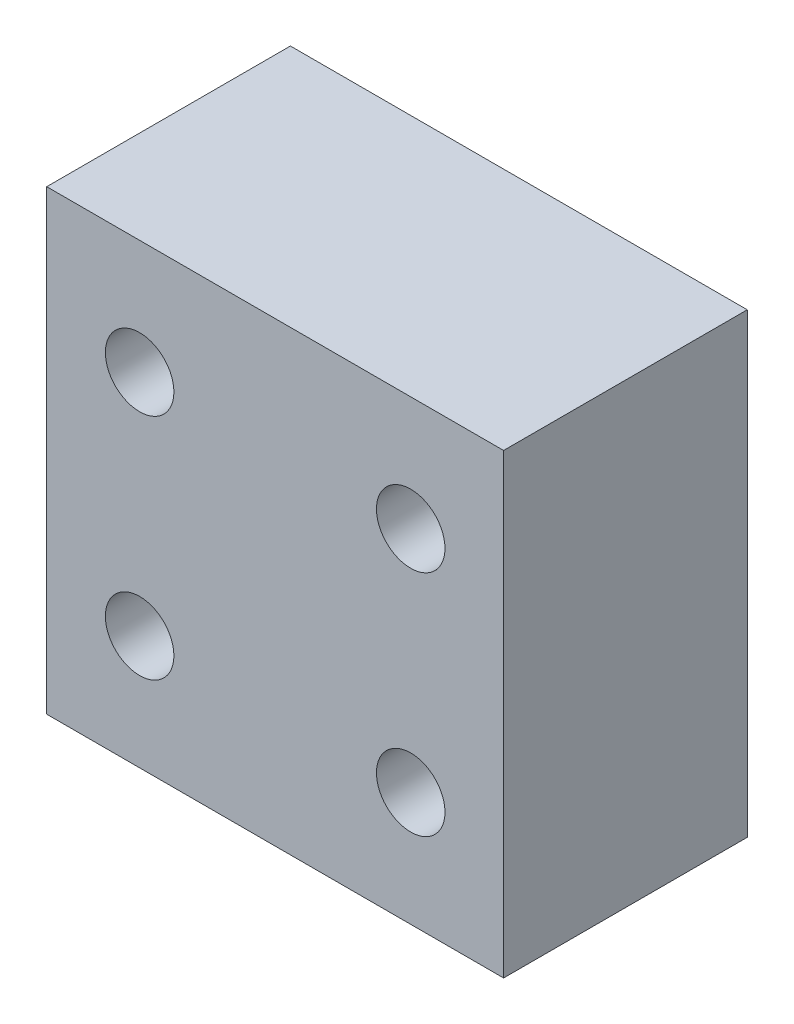
ISO-10303-21;
HEADER;
FILE_DESCRIPTION(('STEP AP214'),'2;1');
FILE_NAME('part.step','',(''),(''),'','','');
FILE_SCHEMA(('AUTOMOTIVE_DESIGN { 1 0 10303 214 1 1 1 1 }'));
ENDSEC;
DATA;
#1=APPLICATION_CONTEXT('core data for automotive mechanical design processes');
#2=APPLICATION_PROTOCOL_DEFINITION('international standard','automotive_design',2000,#1);
#3=PRODUCT_CONTEXT('',#1,'mechanical');
#4=PRODUCT('Part','Part','',(#3));
#5=PRODUCT_RELATED_PRODUCT_CATEGORY('part','',(#4));
#6=PRODUCT_DEFINITION_FORMATION('','',#4);
#7=PRODUCT_DEFINITION_CONTEXT('part definition',#1,'design');
#8=PRODUCT_DEFINITION('design','',#6,#7);
#9=PRODUCT_DEFINITION_SHAPE('','',#8);
#10=(LENGTH_UNIT() NAMED_UNIT(*) SI_UNIT(.MILLI.,.METRE.));
#11=(NAMED_UNIT(*) PLANE_ANGLE_UNIT() SI_UNIT($,.RADIAN.));
#12=(NAMED_UNIT(*) SI_UNIT($,.STERADIAN.) SOLID_ANGLE_UNIT());
#13=UNCERTAINTY_MEASURE_WITH_UNIT(LENGTH_MEASURE(1.E-05),#10,'distance_accuracy_value','');
#14=(GEOMETRIC_REPRESENTATION_CONTEXT(3) GLOBAL_UNCERTAINTY_ASSIGNED_CONTEXT((#13)) GLOBAL_UNIT_ASSIGNED_CONTEXT((#10,
#11,#12)) REPRESENTATION_CONTEXT('',''));
#15=CARTESIAN_POINT('',(0.,0.,0.));
#16=DIRECTION('',(0.,0.,1.));
#17=DIRECTION('',(1.,0.,0.));
#18=AXIS2_PLACEMENT_3D('',#15,#16,#17);
#19=CARTESIAN_POINT('',(15.,15.,16.));
#20=DIRECTION('',(-1.,0.,0.));
#21=DIRECTION('',(0.,0.,1.));
#22=AXIS2_PLACEMENT_3D('',#19,#20,#21);
#23=PLANE('',#22);
#24=DIRECTION('',(0.,1.,0.));
#25=VECTOR('',#24,1.);
#26=CARTESIAN_POINT('',(15.,15.,0.));
#27=LINE('',#26,#25);
#28=CARTESIAN_POINT('',(15.,-15.,0.));
#29=VERTEX_POINT('',#28);
#30=CARTESIAN_POINT('',(15.,15.,0.));
#31=VERTEX_POINT('',#30);
#32=EDGE_CURVE('E107',#29,#31,#27,.T.);
#33=ORIENTED_EDGE('',*,*,#32,.T.);
#34=DIRECTION('',(0.,0.,-1.));
#35=VECTOR('',#34,1.);
#36=CARTESIAN_POINT('',(15.,15.,16.));
#37=LINE('',#36,#35);
#38=CARTESIAN_POINT('',(15.,15.,16.));
#39=VERTEX_POINT('',#38);
#40=EDGE_CURVE('E11',#39,#31,#37,.T.);
#41=ORIENTED_EDGE('',*,*,#40,.F.);
#42=DIRECTION('',(0.,1.,0.));
#43=VECTOR('',#42,1.);
#44=CARTESIAN_POINT('',(15.,15.,16.));
#45=LINE('',#44,#43);
#46=CARTESIAN_POINT('',(15.,-15.,16.));
#47=VERTEX_POINT('',#46);
#48=EDGE_CURVE('E91',#47,#39,#45,.T.);
#49=ORIENTED_EDGE('',*,*,#48,.F.);
#50=DIRECTION('',(0.,0.,-1.));
#51=VECTOR('',#50,1.);
#52=CARTESIAN_POINT('',(15.,-15.,16.));
#53=LINE('',#52,#51);
#54=EDGE_CURVE('E103',#47,#29,#53,.T.);
#55=ORIENTED_EDGE('',*,*,#54,.T.);
#56=EDGE_LOOP('',(#33,#41,#49,#55));
#57=FACE_BOUND('',#56,.T.);
#58=ADVANCED_FACE('F39',(#57),#23,.F.);
#59=CARTESIAN_POINT('',(-15.,15.,16.));
#60=DIRECTION('',(0.,-1.,0.));
#61=DIRECTION('',(0.,0.,-1.));
#62=AXIS2_PLACEMENT_3D('',#59,#60,#61);
#63=PLANE('',#62);
#64=DIRECTION('',(-1.,0.,0.));
#65=VECTOR('',#64,1.);
#66=CARTESIAN_POINT('',(-15.,15.,0.));
#67=LINE('',#66,#65);
#68=CARTESIAN_POINT('',(-15.,15.,0.));
#69=VERTEX_POINT('',#68);
#70=EDGE_CURVE('E96',#31,#69,#67,.T.);
#71=ORIENTED_EDGE('',*,*,#70,.T.);
#72=DIRECTION('',(0.,0.,-1.));
#73=VECTOR('',#72,1.);
#74=CARTESIAN_POINT('',(-15.,15.,16.));
#75=LINE('',#74,#73);
#76=CARTESIAN_POINT('',(-15.,15.,16.));
#77=VERTEX_POINT('',#76);
#78=EDGE_CURVE('E48',#77,#69,#75,.T.);
#79=ORIENTED_EDGE('',*,*,#78,.F.);
#80=DIRECTION('',(-1.,0.,0.));
#81=VECTOR('',#80,1.);
#82=CARTESIAN_POINT('',(-15.,15.,16.));
#83=LINE('',#82,#81);
#84=EDGE_CURVE('E86',#39,#77,#83,.T.);
#85=ORIENTED_EDGE('',*,*,#84,.F.);
#86=ORIENTED_EDGE('',*,*,#40,.T.);
#87=EDGE_LOOP('',(#71,#79,#85,#86));
#88=FACE_BOUND('',#87,.T.);
#89=ADVANCED_FACE('F95',(#88),#63,.F.);
#90=CARTESIAN_POINT('',(-15.,15.,16.));
#91=DIRECTION('',(1.,0.,0.));
#92=DIRECTION('',(0.,0.,-1.));
#93=AXIS2_PLACEMENT_3D('',#90,#91,#92);
#94=PLANE('',#93);
#95=DIRECTION('',(0.,-1.,0.));
#96=VECTOR('',#95,1.);
#97=CARTESIAN_POINT('',(-15.,15.,0.));
#98=LINE('',#97,#96);
#99=CARTESIAN_POINT('',(-15.,-15.,0.));
#100=VERTEX_POINT('',#99);
#101=EDGE_CURVE('E73',#69,#100,#98,.T.);
#102=ORIENTED_EDGE('',*,*,#101,.T.);
#103=DIRECTION('',(0.,0.,-1.));
#104=VECTOR('',#103,1.);
#105=CARTESIAN_POINT('',(-15.,-15.,16.));
#106=LINE('',#105,#104);
#107=CARTESIAN_POINT('',(-15.,-15.,16.));
#108=VERTEX_POINT('',#107);
#109=EDGE_CURVE('E98',#108,#100,#106,.T.);
#110=ORIENTED_EDGE('',*,*,#109,.F.);
#111=DIRECTION('',(0.,-1.,0.));
#112=VECTOR('',#111,1.);
#113=CARTESIAN_POINT('',(-15.,15.,16.));
#114=LINE('',#113,#112);
#115=EDGE_CURVE('E89',#77,#108,#114,.T.);
#116=ORIENTED_EDGE('',*,*,#115,.F.);
#117=ORIENTED_EDGE('',*,*,#78,.T.);
#118=EDGE_LOOP('',(#102,#110,#116,#117));
#119=FACE_BOUND('',#118,.T.);
#120=ADVANCED_FACE('F99',(#119),#94,.F.);
#121=CARTESIAN_POINT('',(-15.,-15.,16.));
#122=DIRECTION('',(0.,1.,0.));
#123=DIRECTION('',(0.,0.,1.));
#124=AXIS2_PLACEMENT_3D('',#121,#122,#123);
#125=PLANE('',#124);
#126=DIRECTION('',(1.,0.,0.));
#127=VECTOR('',#126,1.);
#128=CARTESIAN_POINT('',(-15.,-15.,0.));
#129=LINE('',#128,#127);
#130=EDGE_CURVE('E79',#100,#29,#129,.T.);
#131=ORIENTED_EDGE('',*,*,#130,.T.);
#132=ORIENTED_EDGE('',*,*,#54,.F.);
#133=DIRECTION('',(1.,0.,0.));
#134=VECTOR('',#133,1.);
#135=CARTESIAN_POINT('',(-15.,-15.,16.));
#136=LINE('',#135,#134);
#137=EDGE_CURVE('E56',#108,#47,#136,.T.);
#138=ORIENTED_EDGE('',*,*,#137,.F.);
#139=ORIENTED_EDGE('',*,*,#109,.T.);
#140=EDGE_LOOP('',(#131,#132,#138,#139));
#141=FACE_BOUND('',#140,.T.);
#142=ADVANCED_FACE('F121',(#141),#125,.F.);
#143=CARTESIAN_POINT('',(0.,0.,16.));
#144=DIRECTION('',(0.,0.,1.));
#145=DIRECTION('',(1.,0.,0.));
#146=AXIS2_PLACEMENT_3D('',#143,#144,#145);
#147=PLANE('',#146);
#148=CARTESIAN_POINT('',(8.89999999999995,-7.49999999999993,16.));
#149=DIRECTION('',(0.,0.,1.));
#150=DIRECTION('',(1.,0.,0.));
#151=AXIS2_PLACEMENT_3D('',#148,#149,#150);
#152=CIRCLE('',#151,2.25);
#153=CARTESIAN_POINT('',(11.15,-7.49999999999993,16.));
#154=VERTEX_POINT('',#153);
#155=EDGE_CURVE('E145',#154,#154,#152,.T.);
#156=ORIENTED_EDGE('',*,*,#155,.F.);
#157=EDGE_LOOP('',(#156));
#158=FACE_BOUND('',#157,.T.);
#159=CARTESIAN_POINT('',(-8.90000000000006,7.50000000000007,16.));
#160=DIRECTION('',(0.,0.,1.));
#161=DIRECTION('',(1.,0.,0.));
#162=AXIS2_PLACEMENT_3D('',#159,#160,#161);
#163=CIRCLE('',#162,2.25);
#164=CARTESIAN_POINT('',(-6.65000000000006,7.50000000000007,16.));
#165=VERTEX_POINT('',#164);
#166=EDGE_CURVE('E136',#165,#165,#163,.T.);
#167=ORIENTED_EDGE('',*,*,#166,.F.);
#168=EDGE_LOOP('',(#167));
#169=FACE_BOUND('',#168,.T.);
#170=CARTESIAN_POINT('',(-8.90000000000006,-7.49999999999993,16.));
#171=DIRECTION('',(0.,0.,1.));
#172=DIRECTION('',(1.,0.,0.));
#173=AXIS2_PLACEMENT_3D('',#170,#171,#172);
#174=CIRCLE('',#173,2.25);
#175=CARTESIAN_POINT('',(-6.65000000000006,-7.49999999999993,16.));
#176=VERTEX_POINT('',#175);
#177=EDGE_CURVE('E152',#176,#176,#174,.T.);
#178=ORIENTED_EDGE('',*,*,#177,.F.);
#179=EDGE_LOOP('',(#178));
#180=FACE_BOUND('',#179,.T.);
#181=CARTESIAN_POINT('',(8.89999999999995,7.50000000000007,16.));
#182=DIRECTION('',(0.,0.,1.));
#183=DIRECTION('',(1.,0.,0.));
#184=AXIS2_PLACEMENT_3D('',#181,#182,#183);
#185=CIRCLE('',#184,2.25);
#186=CARTESIAN_POINT('',(11.1499999999999,7.50000000000007,16.));
#187=VERTEX_POINT('',#186);
#188=EDGE_CURVE('E128',#187,#187,#185,.T.);
#189=ORIENTED_EDGE('',*,*,#188,.F.);
#190=EDGE_LOOP('',(#189));
#191=FACE_BOUND('',#190,.T.);
#192=ORIENTED_EDGE('',*,*,#48,.T.);
#193=ORIENTED_EDGE('',*,*,#84,.T.);
#194=ORIENTED_EDGE('',*,*,#115,.T.);
#195=ORIENTED_EDGE('',*,*,#137,.T.);
#196=EDGE_LOOP('',(#192,#193,#194,#195));
#197=FACE_BOUND('',#196,.T.);
#198=ADVANCED_FACE('F87',(#158,#169,#180,#191,#197),#147,.T.);
#199=CARTESIAN_POINT('',(0.,0.,0.));
#200=DIRECTION('',(0.,0.,1.));
#201=DIRECTION('',(1.,0.,0.));
#202=AXIS2_PLACEMENT_3D('',#199,#200,#201);
#203=PLANE('',#202);
#204=CARTESIAN_POINT('',(8.89999999999995,-7.49999999999993,0.));
#205=DIRECTION('',(0.,0.,1.));
#206=DIRECTION('',(1.,0.,0.));
#207=AXIS2_PLACEMENT_3D('',#204,#205,#206);
#208=CIRCLE('',#207,2.25);
#209=CARTESIAN_POINT('',(11.15,-7.49999999999993,0.));
#210=VERTEX_POINT('',#209);
#211=EDGE_CURVE('E132',#210,#210,#208,.T.);
#212=ORIENTED_EDGE('',*,*,#211,.T.);
#213=EDGE_LOOP('',(#212));
#214=FACE_BOUND('',#213,.T.);
#215=CARTESIAN_POINT('',(-8.90000000000006,7.50000000000007,0.));
#216=DIRECTION('',(0.,0.,1.));
#217=DIRECTION('',(1.,0.,0.));
#218=AXIS2_PLACEMENT_3D('',#215,#216,#217);
#219=CIRCLE('',#218,2.25);
#220=CARTESIAN_POINT('',(-6.65000000000006,7.50000000000007,0.));
#221=VERTEX_POINT('',#220);
#222=EDGE_CURVE('E140',#221,#221,#219,.T.);
#223=ORIENTED_EDGE('',*,*,#222,.T.);
#224=EDGE_LOOP('',(#223));
#225=FACE_BOUND('',#224,.T.);
#226=CARTESIAN_POINT('',(-8.90000000000006,-7.49999999999993,0.));
#227=DIRECTION('',(0.,0.,1.));
#228=DIRECTION('',(1.,0.,0.));
#229=AXIS2_PLACEMENT_3D('',#226,#227,#228);
#230=CIRCLE('',#229,2.25);
#231=CARTESIAN_POINT('',(-6.65000000000006,-7.49999999999993,0.));
#232=VERTEX_POINT('',#231);
#233=EDGE_CURVE('E141',#232,#232,#230,.T.);
#234=ORIENTED_EDGE('',*,*,#233,.T.);
#235=EDGE_LOOP('',(#234));
#236=FACE_BOUND('',#235,.T.);
#237=CARTESIAN_POINT('',(8.89999999999995,7.50000000000007,0.));
#238=DIRECTION('',(0.,0.,1.));
#239=DIRECTION('',(1.,0.,0.));
#240=AXIS2_PLACEMENT_3D('',#237,#238,#239);
#241=CIRCLE('',#240,2.25);
#242=CARTESIAN_POINT('',(11.1499999999999,7.50000000000007,0.));
#243=VERTEX_POINT('',#242);
#244=EDGE_CURVE('E111',#243,#243,#241,.T.);
#245=ORIENTED_EDGE('',*,*,#244,.T.);
#246=EDGE_LOOP('',(#245));
#247=FACE_BOUND('',#246,.T.);
#248=ORIENTED_EDGE('',*,*,#32,.F.);
#249=ORIENTED_EDGE('',*,*,#130,.F.);
#250=ORIENTED_EDGE('',*,*,#101,.F.);
#251=ORIENTED_EDGE('',*,*,#70,.F.);
#252=EDGE_LOOP('',(#248,#249,#250,#251));
#253=FACE_BOUND('',#252,.T.);
#254=ADVANCED_FACE('F124',(#214,#225,#236,#247,#253),#203,.F.);
#255=CARTESIAN_POINT('',(8.89999999999995,7.50000000000007,0.));
#256=DIRECTION('',(0.,0.,1.));
#257=DIRECTION('',(1.,0.,0.));
#258=AXIS2_PLACEMENT_3D('',#255,#256,#257);
#259=CYLINDRICAL_SURFACE('',#258,2.25);
#260=ORIENTED_EDGE('',*,*,#244,.F.);
#261=EDGE_LOOP('',(#260));
#262=FACE_BOUND('',#261,.T.);
#263=ORIENTED_EDGE('',*,*,#188,.T.);
#264=EDGE_LOOP('',(#263));
#265=FACE_BOUND('',#264,.T.);
#266=ADVANCED_FACE('F166',(#262,#265),#259,.F.);
#267=CARTESIAN_POINT('',(-8.90000000000006,-7.49999999999993,0.));
#268=DIRECTION('',(0.,0.,1.));
#269=DIRECTION('',(1.,0.,0.));
#270=AXIS2_PLACEMENT_3D('',#267,#268,#269);
#271=CYLINDRICAL_SURFACE('',#270,2.25);
#272=ORIENTED_EDGE('',*,*,#233,.F.);
#273=EDGE_LOOP('',(#272));
#274=FACE_BOUND('',#273,.T.);
#275=ORIENTED_EDGE('',*,*,#177,.T.);
#276=EDGE_LOOP('',(#275));
#277=FACE_BOUND('',#276,.T.);
#278=ADVANCED_FACE('F162',(#274,#277),#271,.F.);
#279=CARTESIAN_POINT('',(-8.90000000000006,7.50000000000007,0.));
#280=DIRECTION('',(0.,0.,1.));
#281=DIRECTION('',(1.,0.,0.));
#282=AXIS2_PLACEMENT_3D('',#279,#280,#281);
#283=CYLINDRICAL_SURFACE('',#282,2.25);
#284=ORIENTED_EDGE('',*,*,#222,.F.);
#285=EDGE_LOOP('',(#284));
#286=FACE_BOUND('',#285,.T.);
#287=ORIENTED_EDGE('',*,*,#166,.T.);
#288=EDGE_LOOP('',(#287));
#289=FACE_BOUND('',#288,.T.);
#290=ADVANCED_FACE('F165',(#286,#289),#283,.F.);
#291=CARTESIAN_POINT('',(8.89999999999995,-7.49999999999993,0.));
#292=DIRECTION('',(0.,0.,1.));
#293=DIRECTION('',(1.,0.,0.));
#294=AXIS2_PLACEMENT_3D('',#291,#292,#293);
#295=CYLINDRICAL_SURFACE('',#294,2.25);
#296=ORIENTED_EDGE('',*,*,#211,.F.);
#297=EDGE_LOOP('',(#296));
#298=FACE_BOUND('',#297,.T.);
#299=ORIENTED_EDGE('',*,*,#155,.T.);
#300=EDGE_LOOP('',(#299));
#301=FACE_BOUND('',#300,.T.);
#302=ADVANCED_FACE('F227',(#298,#301),#295,.F.);
#303=CLOSED_SHELL('',(#58,#89,#120,#142,#198,#254,#266,#278,#290,#302));
#304=MANIFOLD_SOLID_BREP('B2',#303);
#305=ADVANCED_BREP_SHAPE_REPRESENTATION('',(#18,#304),#14);
#306=SHAPE_DEFINITION_REPRESENTATION(#9,#305);
ENDSEC;
END-ISO-10303-21;
